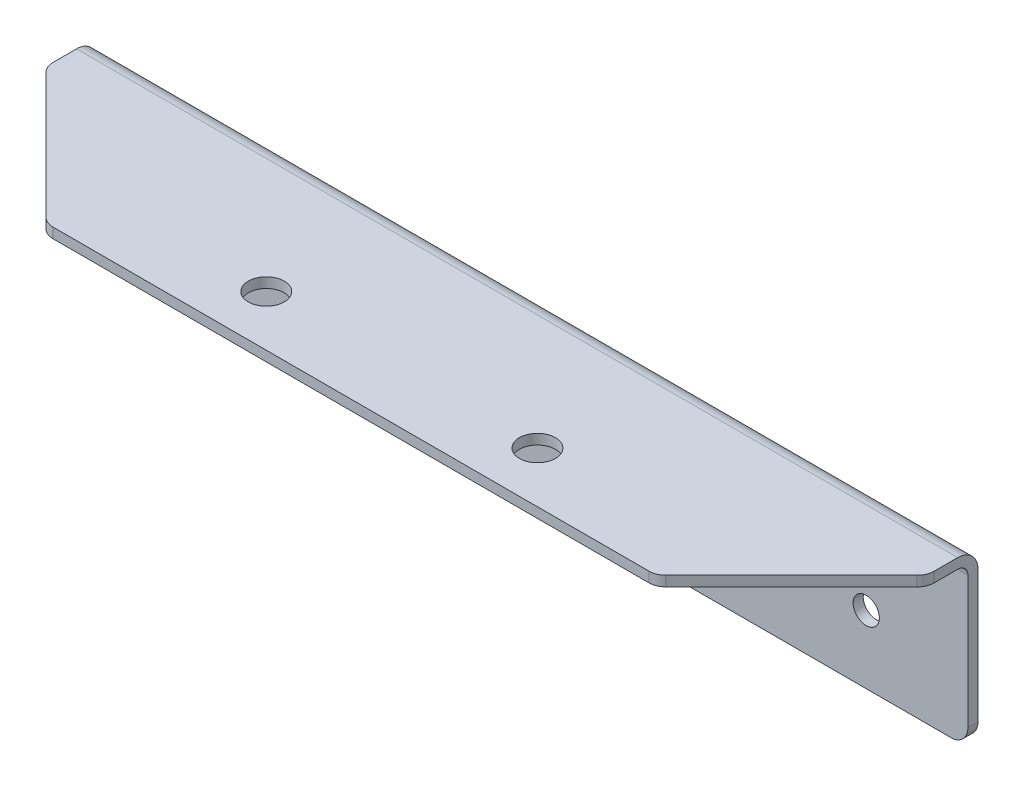
ISO-10303-21;
HEADER;
FILE_DESCRIPTION(('STEP AP214'),'2;1');
FILE_NAME('part.step','',(''),(''),'','','');
FILE_SCHEMA(('AUTOMOTIVE_DESIGN { 1 0 10303 214 1 1 1 1 }'));
ENDSEC;
DATA;
#1=APPLICATION_CONTEXT('core data for automotive mechanical design processes');
#2=APPLICATION_PROTOCOL_DEFINITION('international standard','automotive_design',2000,#1);
#3=PRODUCT_CONTEXT('',#1,'mechanical');
#4=PRODUCT('Part','Part','',(#3));
#5=PRODUCT_RELATED_PRODUCT_CATEGORY('part','',(#4));
#6=PRODUCT_DEFINITION_FORMATION('','',#4);
#7=PRODUCT_DEFINITION_CONTEXT('part definition',#1,'design');
#8=PRODUCT_DEFINITION('design','',#6,#7);
#9=PRODUCT_DEFINITION_SHAPE('','',#8);
#10=(LENGTH_UNIT() NAMED_UNIT(*) SI_UNIT(.MILLI.,.METRE.));
#11=(NAMED_UNIT(*) PLANE_ANGLE_UNIT() SI_UNIT($,.RADIAN.));
#12=(NAMED_UNIT(*) SI_UNIT($,.STERADIAN.) SOLID_ANGLE_UNIT());
#13=UNCERTAINTY_MEASURE_WITH_UNIT(LENGTH_MEASURE(1.E-05),#10,'distance_accuracy_value','');
#14=(GEOMETRIC_REPRESENTATION_CONTEXT(3) GLOBAL_UNCERTAINTY_ASSIGNED_CONTEXT((#13)) GLOBAL_UNIT_ASSIGNED_CONTEXT((#10,
#11,#12)) REPRESENTATION_CONTEXT('',''));
#15=CARTESIAN_POINT('',(0.,0.,0.));
#16=DIRECTION('',(0.,0.,1.));
#17=DIRECTION('',(1.,0.,0.));
#18=AXIS2_PLACEMENT_3D('',#15,#16,#17);
#19=CARTESIAN_POINT('',(-7208.55175,-740.648760000001,8.86714));
#20=DIRECTION('',(-1.,0.,0.));
#21=DIRECTION('',(0.,0.707106781186548,-0.707106781186548));
#22=AXIS2_PLACEMENT_3D('',#19,#20,#21);
#23=CYLINDRICAL_SURFACE('',#22,1.89738);
#24=CARTESIAN_POINT('',(-7126.00175,-740.648760000001,8.86714));
#25=DIRECTION('',(-1.,0.,0.));
#26=DIRECTION('',(0.,-1.,0.));
#27=AXIS2_PLACEMENT_3D('',#24,#25,#26);
#28=CIRCLE('',#27,1.89738);
#29=CARTESIAN_POINT('',(-7126.00175,-738.751380000001,8.86714));
#30=VERTEX_POINT('',#29);
#31=CARTESIAN_POINT('',(-7126.00175,-740.648760000001,6.96976));
#32=VERTEX_POINT('',#31);
#33=EDGE_CURVE('E20',#30,#32,#28,.T.);
#34=ORIENTED_EDGE('',*,*,#33,.F.);
#35=DIRECTION('',(-1.,0.,0.));
#36=VECTOR('',#35,1.);
#37=CARTESIAN_POINT('',(-7208.55175,-738.751380000001,8.86714));
#38=LINE('',#37,#36);
#39=CARTESIAN_POINT('',(-7291.10175,-738.751380000001,8.86713999999984));
#40=VERTEX_POINT('',#39);
#41=EDGE_CURVE('E297',#30,#40,#38,.T.);
#42=ORIENTED_EDGE('',*,*,#41,.T.);
#43=CARTESIAN_POINT('',(-7291.10175,-740.648760000001,8.86714));
#44=DIRECTION('',(-1.,0.,0.));
#45=DIRECTION('',(0.,-1.,0.));
#46=AXIS2_PLACEMENT_3D('',#43,#44,#45);
#47=CIRCLE('',#46,1.89738);
#48=CARTESIAN_POINT('',(-7291.10175,-740.648760000001,6.96976));
#49=VERTEX_POINT('',#48);
#50=EDGE_CURVE('E380',#40,#49,#47,.T.);
#51=ORIENTED_EDGE('',*,*,#50,.T.);
#52=DIRECTION('',(-1.,0.,0.));
#53=VECTOR('',#52,1.);
#54=CARTESIAN_POINT('',(-7698.77937,-740.648760000001,6.96976));
#55=LINE('',#54,#53);
#56=EDGE_CURVE('E373',#32,#49,#55,.T.);
#57=ORIENTED_EDGE('',*,*,#56,.F.);
#58=EDGE_LOOP('',(#34,#42,#51,#57));
#59=FACE_BOUND('',#58,.T.);
#60=ADVANCED_FACE('F17',(#59),#23,.F.);
#61=CARTESIAN_POINT('',(-7208.55175,-740.648760000001,8.86714));
#62=DIRECTION('',(-1.,0.,0.));
#63=DIRECTION('',(0.,0.707106781186548,-0.707106781186548));
#64=AXIS2_PLACEMENT_3D('',#61,#62,#63);
#65=CYLINDRICAL_SURFACE('',#64,3.79476);
#66=CARTESIAN_POINT('',(-7126.00175,-740.648760000001,8.86714));
#67=DIRECTION('',(-1.,0.,0.));
#68=DIRECTION('',(0.,-1.,0.));
#69=AXIS2_PLACEMENT_3D('',#66,#67,#68);
#70=CIRCLE('',#69,3.79476);
#71=CARTESIAN_POINT('',(-7126.00175,-736.854,8.86714));
#72=VERTEX_POINT('',#71);
#73=CARTESIAN_POINT('',(-7126.00175,-740.648760000001,5.07238));
#74=VERTEX_POINT('',#73);
#75=EDGE_CURVE('E11',#72,#74,#70,.T.);
#76=ORIENTED_EDGE('',*,*,#75,.T.);
#77=DIRECTION('',(-1.,0.,0.));
#78=VECTOR('',#77,1.);
#79=CARTESIAN_POINT('',(-7208.55175,-740.648760000001,5.07238));
#80=LINE('',#79,#78);
#81=CARTESIAN_POINT('',(-7291.10175,-740.648760000001,5.07238000000007));
#82=VERTEX_POINT('',#81);
#83=EDGE_CURVE('E362',#74,#82,#80,.T.);
#84=ORIENTED_EDGE('',*,*,#83,.T.);
#85=CARTESIAN_POINT('',(-7291.10175,-740.648760000001,8.86714));
#86=DIRECTION('',(-1.,0.,0.));
#87=DIRECTION('',(0.,-1.,0.));
#88=AXIS2_PLACEMENT_3D('',#85,#86,#87);
#89=CIRCLE('',#88,3.79476);
#90=CARTESIAN_POINT('',(-7291.10175,-736.854,8.86713999999984));
#91=VERTEX_POINT('',#90);
#92=EDGE_CURVE('E377',#91,#82,#89,.T.);
#93=ORIENTED_EDGE('',*,*,#92,.F.);
#94=DIRECTION('',(-1.,0.,0.));
#95=VECTOR('',#94,1.);
#96=CARTESIAN_POINT('',(-7208.55175,-736.854,8.86714));
#97=LINE('',#96,#95);
#98=EDGE_CURVE('E277',#72,#91,#97,.T.);
#99=ORIENTED_EDGE('',*,*,#98,.F.);
#100=EDGE_LOOP('',(#76,#84,#93,#99));
#101=FACE_BOUND('',#100,.T.);
#102=ADVANCED_FACE('F454',(#101),#65,.T.);
#103=CARTESIAN_POINT('',(-7272.05175,-755.904,6.96976));
#104=DIRECTION('',(0.,0.,-1.));
#105=DIRECTION('',(-1.,0.,0.));
#106=AXIS2_PLACEMENT_3D('',#103,#104,#105);
#107=CYLINDRICAL_SURFACE('',#106,2.45744999999964);
#108=CARTESIAN_POINT('',(-7272.05175,-755.904,5.07238));
#109=DIRECTION('',(0.,0.,-1.));
#110=DIRECTION('',(1.,0.,0.));
#111=AXIS2_PLACEMENT_3D('',#108,#109,#110);
#112=CIRCLE('',#111,2.45744999999964);
#113=CARTESIAN_POINT('',(-7269.5943,-755.904,5.07238));
#114=VERTEX_POINT('',#113);
#115=EDGE_CURVE('E350',#114,#114,#112,.T.);
#116=ORIENTED_EDGE('',*,*,#115,.T.);
#117=EDGE_LOOP('',(#116));
#118=FACE_BOUND('',#117,.T.);
#119=CARTESIAN_POINT('',(-7272.05175,-755.904,6.96976));
#120=DIRECTION('',(0.,0.,-1.));
#121=DIRECTION('',(-1.,0.,0.));
#122=AXIS2_PLACEMENT_3D('',#119,#120,#121);
#123=CIRCLE('',#122,2.45744999999964);
#124=CARTESIAN_POINT('',(-7274.5092,-755.904,6.96976));
#125=VERTEX_POINT('',#124);
#126=EDGE_CURVE('E250',#125,#125,#123,.T.);
#127=ORIENTED_EDGE('',*,*,#126,.F.);
#128=EDGE_LOOP('',(#127));
#129=FACE_BOUND('',#128,.T.);
#130=ADVANCED_FACE('F456',(#118,#129),#107,.F.);
#131=CARTESIAN_POINT('',(-7176.80175,-755.904,6.96976));
#132=DIRECTION('',(0.,0.,-1.));
#133=DIRECTION('',(-1.,0.,0.));
#134=AXIS2_PLACEMENT_3D('',#131,#132,#133);
#135=CYLINDRICAL_SURFACE('',#134,2.45744999999964);
#136=CARTESIAN_POINT('',(-7176.80175,-755.904,5.07238));
#137=DIRECTION('',(0.,0.,-1.));
#138=DIRECTION('',(1.,0.,0.));
#139=AXIS2_PLACEMENT_3D('',#136,#137,#138);
#140=CIRCLE('',#139,2.45744999999964);
#141=CARTESIAN_POINT('',(-7174.3443,-755.904,5.07238));
#142=VERTEX_POINT('',#141);
#143=EDGE_CURVE('E306',#142,#142,#140,.T.);
#144=ORIENTED_EDGE('',*,*,#143,.T.);
#145=EDGE_LOOP('',(#144));
#146=FACE_BOUND('',#145,.T.);
#147=CARTESIAN_POINT('',(-7176.80175,-755.904,6.96976));
#148=DIRECTION('',(0.,0.,-1.));
#149=DIRECTION('',(-1.,0.,0.));
#150=AXIS2_PLACEMENT_3D('',#147,#148,#149);
#151=CIRCLE('',#150,2.45744999999964);
#152=CARTESIAN_POINT('',(-7179.2592,-755.904,6.96976));
#153=VERTEX_POINT('',#152);
#154=EDGE_CURVE('E245',#153,#153,#151,.T.);
#155=ORIENTED_EDGE('',*,*,#154,.F.);
#156=EDGE_LOOP('',(#155));
#157=FACE_BOUND('',#156,.T.);
#158=ADVANCED_FACE('F448',(#146,#157),#135,.F.);
#159=CARTESIAN_POINT('',(-7240.30175,-755.904,6.96976));
#160=DIRECTION('',(0.,0.,-1.));
#161=DIRECTION('',(-1.,0.,0.));
#162=AXIS2_PLACEMENT_3D('',#159,#160,#161);
#163=CYLINDRICAL_SURFACE('',#162,2.45744999999964);
#164=CARTESIAN_POINT('',(-7240.30175,-755.904,5.07238));
#165=DIRECTION('',(0.,0.,-1.));
#166=DIRECTION('',(1.,0.,0.));
#167=AXIS2_PLACEMENT_3D('',#164,#165,#166);
#168=CIRCLE('',#167,2.45744999999964);
#169=CARTESIAN_POINT('',(-7237.8443,-755.904,5.07238));
#170=VERTEX_POINT('',#169);
#171=EDGE_CURVE('E304',#170,#170,#168,.T.);
#172=ORIENTED_EDGE('',*,*,#171,.T.);
#173=EDGE_LOOP('',(#172));
#174=FACE_BOUND('',#173,.T.);
#175=CARTESIAN_POINT('',(-7240.30175,-755.904,6.96976));
#176=DIRECTION('',(0.,0.,-1.));
#177=DIRECTION('',(-1.,0.,0.));
#178=AXIS2_PLACEMENT_3D('',#175,#176,#177);
#179=CIRCLE('',#178,2.45744999999964);
#180=CARTESIAN_POINT('',(-7242.7592,-755.904,6.96976));
#181=VERTEX_POINT('',#180);
#182=EDGE_CURVE('E247',#181,#181,#179,.T.);
#183=ORIENTED_EDGE('',*,*,#182,.F.);
#184=EDGE_LOOP('',(#183));
#185=FACE_BOUND('',#184,.T.);
#186=ADVANCED_FACE('F438',(#174,#185),#163,.F.);
#187=CARTESIAN_POINT('',(-7145.05175,-755.904,6.96976));
#188=DIRECTION('',(0.,0.,-1.));
#189=DIRECTION('',(-1.,0.,0.));
#190=AXIS2_PLACEMENT_3D('',#187,#188,#189);
#191=CYLINDRICAL_SURFACE('',#190,2.45744999999964);
#192=CARTESIAN_POINT('',(-7145.05175,-755.904,5.07238));
#193=DIRECTION('',(0.,0.,-1.));
#194=DIRECTION('',(1.,0.,0.));
#195=AXIS2_PLACEMENT_3D('',#192,#193,#194);
#196=CIRCLE('',#195,2.45744999999964);
#197=CARTESIAN_POINT('',(-7142.5943,-755.904,5.07238));
#198=VERTEX_POINT('',#197);
#199=EDGE_CURVE('E307',#198,#198,#196,.T.);
#200=ORIENTED_EDGE('',*,*,#199,.T.);
#201=EDGE_LOOP('',(#200));
#202=FACE_BOUND('',#201,.T.);
#203=CARTESIAN_POINT('',(-7145.05175,-755.904,6.96976));
#204=DIRECTION('',(0.,0.,-1.));
#205=DIRECTION('',(-1.,0.,0.));
#206=AXIS2_PLACEMENT_3D('',#203,#204,#205);
#207=CIRCLE('',#206,2.45744999999964);
#208=CARTESIAN_POINT('',(-7147.5092,-755.904,6.96976));
#209=VERTEX_POINT('',#208);
#210=EDGE_CURVE('E292',#209,#209,#207,.T.);
#211=ORIENTED_EDGE('',*,*,#210,.F.);
#212=EDGE_LOOP('',(#211));
#213=FACE_BOUND('',#212,.T.);
#214=ADVANCED_FACE('F436',(#202,#213),#191,.F.);
#215=CARTESIAN_POINT('',(-7208.55175,-755.904,6.96976));
#216=DIRECTION('',(0.,0.,-1.));
#217=DIRECTION('',(-1.,0.,0.));
#218=AXIS2_PLACEMENT_3D('',#215,#216,#217);
#219=CYLINDRICAL_SURFACE('',#218,2.45744999999964);
#220=CARTESIAN_POINT('',(-7208.55175,-755.904,5.07238));
#221=DIRECTION('',(0.,0.,-1.));
#222=DIRECTION('',(1.,0.,0.));
#223=AXIS2_PLACEMENT_3D('',#220,#221,#222);
#224=CIRCLE('',#223,2.45744999999964);
#225=CARTESIAN_POINT('',(-7206.0943,-755.904,5.07238));
#226=VERTEX_POINT('',#225);
#227=EDGE_CURVE('E359',#226,#226,#224,.T.);
#228=ORIENTED_EDGE('',*,*,#227,.T.);
#229=EDGE_LOOP('',(#228));
#230=FACE_BOUND('',#229,.T.);
#231=CARTESIAN_POINT('',(-7208.55175,-755.904,6.96976));
#232=DIRECTION('',(0.,0.,-1.));
#233=DIRECTION('',(-1.,0.,0.));
#234=AXIS2_PLACEMENT_3D('',#231,#232,#233);
#235=CIRCLE('',#234,2.45744999999964);
#236=CARTESIAN_POINT('',(-7211.0092,-755.904,6.96976));
#237=VERTEX_POINT('',#236);
#238=EDGE_CURVE('E369',#237,#237,#235,.T.);
#239=ORIENTED_EDGE('',*,*,#238,.F.);
#240=EDGE_LOOP('',(#239));
#241=FACE_BOUND('',#240,.T.);
#242=ADVANCED_FACE('F437',(#230,#241),#219,.F.);
#243=CARTESIAN_POINT('',(-7698.77937,-288.925,6.96976));
#244=DIRECTION('',(0.,0.,1.));
#245=DIRECTION('',(1.,0.,0.));
#246=AXIS2_PLACEMENT_3D('',#243,#244,#245);
#247=PLANE('',#246);
#248=DIRECTION('',(-1.,0.,0.));
#249=VECTOR('',#248,1.);
#250=CARTESIAN_POINT('',(-7698.77937,-768.604,6.96976));
#251=LINE('',#250,#249);
#252=CARTESIAN_POINT('',(-7129.17675,-768.604,6.96976));
#253=VERTEX_POINT('',#252);
#254=CARTESIAN_POINT('',(-7287.92675,-768.604,6.96976));
#255=VERTEX_POINT('',#254);
#256=EDGE_CURVE('E281',#253,#255,#251,.T.);
#257=ORIENTED_EDGE('',*,*,#256,.F.);
#258=CARTESIAN_POINT('',(-7129.17675,-765.429,6.96976));
#259=DIRECTION('',(0.,0.,-1.));
#260=DIRECTION('',(1.,0.,0.));
#261=AXIS2_PLACEMENT_3D('',#258,#259,#260);
#262=CIRCLE('',#261,3.175);
#263=CARTESIAN_POINT('',(-7126.00175,-765.429,6.96976));
#264=VERTEX_POINT('',#263);
#265=EDGE_CURVE('E330',#264,#253,#262,.T.);
#266=ORIENTED_EDGE('',*,*,#265,.F.);
#267=DIRECTION('',(0.,1.,0.));
#268=VECTOR('',#267,1.);
#269=CARTESIAN_POINT('',(-7126.00175,-288.925,6.96976));
#270=LINE('',#269,#268);
#271=EDGE_CURVE('E318',#264,#32,#270,.T.);
#272=ORIENTED_EDGE('',*,*,#271,.T.);
#273=ORIENTED_EDGE('',*,*,#56,.T.);
#274=DIRECTION('',(0.,-1.,0.));
#275=VECTOR('',#274,1.);
#276=CARTESIAN_POINT('',(-7291.10175,-288.925,6.96976));
#277=LINE('',#276,#275);
#278=CARTESIAN_POINT('',(-7291.10175,-765.429,6.96976));
#279=VERTEX_POINT('',#278);
#280=EDGE_CURVE('E313',#49,#279,#277,.T.);
#281=ORIENTED_EDGE('',*,*,#280,.T.);
#282=CARTESIAN_POINT('',(-7287.92675,-765.429,6.96976));
#283=DIRECTION('',(0.,0.,-1.));
#284=DIRECTION('',(1.,0.,0.));
#285=AXIS2_PLACEMENT_3D('',#282,#283,#284);
#286=CIRCLE('',#285,3.175);
#287=EDGE_CURVE('E48',#255,#279,#286,.T.);
#288=ORIENTED_EDGE('',*,*,#287,.F.);
#289=EDGE_LOOP('',(#257,#266,#272,#273,#281,#288));
#290=FACE_BOUND('',#289,.T.);
#291=ORIENTED_EDGE('',*,*,#238,.T.);
#292=EDGE_LOOP('',(#291));
#293=FACE_BOUND('',#292,.T.);
#294=ORIENTED_EDGE('',*,*,#210,.T.);
#295=EDGE_LOOP('',(#294));
#296=FACE_BOUND('',#295,.T.);
#297=ORIENTED_EDGE('',*,*,#182,.T.);
#298=EDGE_LOOP('',(#297));
#299=FACE_BOUND('',#298,.T.);
#300=ORIENTED_EDGE('',*,*,#154,.T.);
#301=EDGE_LOOP('',(#300));
#302=FACE_BOUND('',#301,.T.);
#303=ORIENTED_EDGE('',*,*,#126,.T.);
#304=EDGE_LOOP('',(#303));
#305=FACE_BOUND('',#304,.T.);
#306=ADVANCED_FACE('F394',(#290,#293,#296,#299,#302,#305),#247,.T.);
#307=CARTESIAN_POINT('',(-7698.77937,-288.925,5.07238));
#308=DIRECTION('',(0.,0.,1.));
#309=DIRECTION('',(1.,0.,0.));
#310=AXIS2_PLACEMENT_3D('',#307,#308,#309);
#311=PLANE('',#310);
#312=DIRECTION('',(-1.,0.,0.));
#313=VECTOR('',#312,1.);
#314=CARTESIAN_POINT('',(-7208.55175,-768.604,5.07238));
#315=LINE('',#314,#313);
#316=CARTESIAN_POINT('',(-7129.17675,-768.604,5.07238));
#317=VERTEX_POINT('',#316);
#318=CARTESIAN_POINT('',(-7287.92675,-768.604,5.07238));
#319=VERTEX_POINT('',#318);
#320=EDGE_CURVE('E339',#317,#319,#315,.T.);
#321=ORIENTED_EDGE('',*,*,#320,.T.);
#322=CARTESIAN_POINT('',(-7287.92675,-765.429,5.07238));
#323=DIRECTION('',(0.,0.,-1.));
#324=DIRECTION('',(-1.,0.,0.));
#325=AXIS2_PLACEMENT_3D('',#322,#323,#324);
#326=CIRCLE('',#325,3.175);
#327=CARTESIAN_POINT('',(-7291.10175,-765.429,5.07238));
#328=VERTEX_POINT('',#327);
#329=EDGE_CURVE('E36',#319,#328,#326,.T.);
#330=ORIENTED_EDGE('',*,*,#329,.T.);
#331=DIRECTION('',(0.,-1.,0.));
#332=VECTOR('',#331,1.);
#333=CARTESIAN_POINT('',(-7291.10175,-752.729,5.07238));
#334=LINE('',#333,#332);
#335=EDGE_CURVE('E314',#82,#328,#334,.T.);
#336=ORIENTED_EDGE('',*,*,#335,.F.);
#337=ORIENTED_EDGE('',*,*,#83,.F.);
#338=DIRECTION('',(0.,1.,0.));
#339=VECTOR('',#338,1.);
#340=CARTESIAN_POINT('',(-7126.00175,-288.925,5.07238));
#341=LINE('',#340,#339);
#342=CARTESIAN_POINT('',(-7126.00175,-765.429,5.07238));
#343=VERTEX_POINT('',#342);
#344=EDGE_CURVE('E326',#343,#74,#341,.T.);
#345=ORIENTED_EDGE('',*,*,#344,.F.);
#346=CARTESIAN_POINT('',(-7129.17675,-765.429,5.07238));
#347=DIRECTION('',(0.,0.,-1.));
#348=DIRECTION('',(-1.,0.,0.));
#349=AXIS2_PLACEMENT_3D('',#346,#347,#348);
#350=CIRCLE('',#349,3.175);
#351=EDGE_CURVE('E280',#343,#317,#350,.T.);
#352=ORIENTED_EDGE('',*,*,#351,.T.);
#353=EDGE_LOOP('',(#321,#330,#336,#337,#345,#352));
#354=FACE_BOUND('',#353,.T.);
#355=ORIENTED_EDGE('',*,*,#227,.F.);
#356=EDGE_LOOP('',(#355));
#357=FACE_BOUND('',#356,.T.);
#358=ORIENTED_EDGE('',*,*,#199,.F.);
#359=EDGE_LOOP('',(#358));
#360=FACE_BOUND('',#359,.T.);
#361=ORIENTED_EDGE('',*,*,#171,.F.);
#362=EDGE_LOOP('',(#361));
#363=FACE_BOUND('',#362,.T.);
#364=ORIENTED_EDGE('',*,*,#143,.F.);
#365=EDGE_LOOP('',(#364));
#366=FACE_BOUND('',#365,.T.);
#367=ORIENTED_EDGE('',*,*,#115,.F.);
#368=EDGE_LOOP('',(#367));
#369=FACE_BOUND('',#368,.T.);
#370=ADVANCED_FACE('F464',(#354,#357,#360,#363,#366,#369),#311,.F.);
#371=CARTESIAN_POINT('',(-7287.92675,-765.429,5.07238));
#372=DIRECTION('',(0.,0.,1.));
#373=DIRECTION('',(1.,0.,0.));
#374=AXIS2_PLACEMENT_3D('',#371,#372,#373);
#375=CYLINDRICAL_SURFACE('',#374,3.175);
#376=ORIENTED_EDGE('',*,*,#287,.T.);
#377=DIRECTION('',(0.,0.,-1.));
#378=VECTOR('',#377,1.);
#379=CARTESIAN_POINT('',(-7291.10175,-765.429,5.07238));
#380=LINE('',#379,#378);
#381=EDGE_CURVE('E305',#279,#328,#380,.T.);
#382=ORIENTED_EDGE('',*,*,#381,.T.);
#383=ORIENTED_EDGE('',*,*,#329,.F.);
#384=DIRECTION('',(0.,0.,-1.));
#385=VECTOR('',#384,1.);
#386=CARTESIAN_POINT('',(-7287.92675,-768.604,5.07238));
#387=LINE('',#386,#385);
#388=EDGE_CURVE('E331',#255,#319,#387,.T.);
#389=ORIENTED_EDGE('',*,*,#388,.F.);
#390=EDGE_LOOP('',(#376,#382,#383,#389));
#391=FACE_BOUND('',#390,.T.);
#392=ADVANCED_FACE('F466',(#391),#375,.T.);
#393=CARTESIAN_POINT('',(-7208.55175,-768.604,5.07238));
#394=DIRECTION('',(0.,1.,0.));
#395=DIRECTION('',(1.,0.,0.));
#396=AXIS2_PLACEMENT_3D('',#393,#394,#395);
#397=PLANE('',#396);
#398=DIRECTION('',(0.,0.,-1.));
#399=VECTOR('',#398,1.);
#400=CARTESIAN_POINT('',(-7129.17675,-768.604,5.07238));
#401=LINE('',#400,#399);
#402=EDGE_CURVE('E282',#253,#317,#401,.T.);
#403=ORIENTED_EDGE('',*,*,#402,.F.);
#404=ORIENTED_EDGE('',*,*,#256,.T.);
#405=ORIENTED_EDGE('',*,*,#388,.T.);
#406=ORIENTED_EDGE('',*,*,#320,.F.);
#407=EDGE_LOOP('',(#403,#404,#405,#406));
#408=FACE_BOUND('',#407,.T.);
#409=ADVANCED_FACE('F781',(#408),#397,.F.);
#410=CARTESIAN_POINT('',(-7129.17675,-765.429,5.07238));
#411=DIRECTION('',(0.,0.,1.));
#412=DIRECTION('',(1.,0.,0.));
#413=AXIS2_PLACEMENT_3D('',#410,#411,#412);
#414=CYLINDRICAL_SURFACE('',#413,3.175);
#415=DIRECTION('',(0.,0.,-1.));
#416=VECTOR('',#415,1.);
#417=CARTESIAN_POINT('',(-7126.00175,-765.429,5.07238));
#418=LINE('',#417,#416);
#419=EDGE_CURVE('E325',#264,#343,#418,.T.);
#420=ORIENTED_EDGE('',*,*,#419,.F.);
#421=ORIENTED_EDGE('',*,*,#265,.T.);
#422=ORIENTED_EDGE('',*,*,#402,.T.);
#423=ORIENTED_EDGE('',*,*,#351,.F.);
#424=EDGE_LOOP('',(#420,#421,#422,#423));
#425=FACE_BOUND('',#424,.T.);
#426=ADVANCED_FACE('F399',(#425),#414,.T.);
#427=CARTESIAN_POINT('',(-7233.95175,-738.751380000001,30.47238));
#428=DIRECTION('',(0.,1.,0.));
#429=DIRECTION('',(0.,0.,1.));
#430=AXIS2_PLACEMENT_3D('',#427,#428,#429);
#431=CYLINDRICAL_SURFACE('',#430,3.37820000000022);
#432=CARTESIAN_POINT('',(-7233.95175,-736.854,30.47238));
#433=DIRECTION('',(0.,1.,0.));
#434=DIRECTION('',(0.,0.,-1.));
#435=AXIS2_PLACEMENT_3D('',#432,#433,#434);
#436=CIRCLE('',#435,3.37820000000022);
#437=CARTESIAN_POINT('',(-7233.95175,-736.854,27.0941799999998));
#438=VERTEX_POINT('',#437);
#439=EDGE_CURVE('E268',#438,#438,#436,.T.);
#440=ORIENTED_EDGE('',*,*,#439,.T.);
#441=EDGE_LOOP('',(#440));
#442=FACE_BOUND('',#441,.T.);
#443=CARTESIAN_POINT('',(-7233.95175,-738.751380000001,30.47238));
#444=DIRECTION('',(0.,1.,0.));
#445=DIRECTION('',(0.,0.,1.));
#446=AXIS2_PLACEMENT_3D('',#443,#444,#445);
#447=CIRCLE('',#446,3.37820000000022);
#448=CARTESIAN_POINT('',(-7233.95175,-738.751380000001,33.8505800000002));
#449=VERTEX_POINT('',#448);
#450=EDGE_CURVE('E287',#449,#449,#447,.T.);
#451=ORIENTED_EDGE('',*,*,#450,.F.);
#452=EDGE_LOOP('',(#451));
#453=FACE_BOUND('',#452,.T.);
#454=ADVANCED_FACE('F706',(#442,#453),#431,.F.);
#455=CARTESIAN_POINT('',(-7183.15175,-738.751380000001,30.47238));
#456=DIRECTION('',(0.,1.,0.));
#457=DIRECTION('',(0.,0.,1.));
#458=AXIS2_PLACEMENT_3D('',#455,#456,#457);
#459=CYLINDRICAL_SURFACE('',#458,3.37820000000022);
#460=CARTESIAN_POINT('',(-7183.15175,-736.854,30.47238));
#461=DIRECTION('',(0.,1.,0.));
#462=DIRECTION('',(0.,0.,-1.));
#463=AXIS2_PLACEMENT_3D('',#460,#461,#462);
#464=CIRCLE('',#463,3.37820000000022);
#465=CARTESIAN_POINT('',(-7183.15175,-736.854,27.0941799999998));
#466=VERTEX_POINT('',#465);
#467=EDGE_CURVE('E275',#466,#466,#464,.T.);
#468=ORIENTED_EDGE('',*,*,#467,.T.);
#469=EDGE_LOOP('',(#468));
#470=FACE_BOUND('',#469,.T.);
#471=CARTESIAN_POINT('',(-7183.15175,-738.751380000001,30.47238));
#472=DIRECTION('',(0.,1.,0.));
#473=DIRECTION('',(0.,0.,1.));
#474=AXIS2_PLACEMENT_3D('',#471,#472,#473);
#475=CIRCLE('',#474,3.37820000000022);
#476=CARTESIAN_POINT('',(-7183.15175,-738.751380000001,33.8505800000002));
#477=VERTEX_POINT('',#476);
#478=EDGE_CURVE('E288',#477,#477,#475,.T.);
#479=ORIENTED_EDGE('',*,*,#478,.F.);
#480=EDGE_LOOP('',(#479));
#481=FACE_BOUND('',#480,.T.);
#482=ADVANCED_FACE('F701',(#470,#481),#459,.F.);
#483=CARTESIAN_POINT('',(-7208.55175,-738.751380000001,39.99738));
#484=DIRECTION('',(0.,-1.,0.));
#485=DIRECTION('',(0.,0.,-1.));
#486=AXIS2_PLACEMENT_3D('',#483,#484,#485);
#487=PLANE('',#486);
#488=DIRECTION('',(0.707106781186552,0.,0.707106781186543));
#489=VECTOR('',#488,1.);
#490=CARTESIAN_POINT('',(-7291.10175,-738.751380000001,14.59738));
#491=LINE('',#490,#489);
#492=CARTESIAN_POINT('',(-7290.17181403026,-738.751380000001,15.5273159697322));
#493=VERTEX_POINT('',#492);
#494=CARTESIAN_POINT('',(-7266.63168596973,-738.751380000001,39.0674440302671));
#495=VERTEX_POINT('',#494);
#496=EDGE_CURVE('E256',#493,#495,#491,.T.);
#497=ORIENTED_EDGE('',*,*,#496,.F.);
#498=CARTESIAN_POINT('',(-7287.92675,-738.751380000001,13.2822519394648));
#499=DIRECTION('',(0.,1.,0.));
#500=DIRECTION('',(0.,0.,-1.));
#501=AXIS2_PLACEMENT_3D('',#498,#499,#500);
#502=CIRCLE('',#501,3.175);
#503=CARTESIAN_POINT('',(-7291.10175,-738.751380000001,13.2822519394648));
#504=VERTEX_POINT('',#503);
#505=EDGE_CURVE('E214',#504,#493,#502,.T.);
#506=ORIENTED_EDGE('',*,*,#505,.F.);
#507=DIRECTION('',(0.,0.,-1.));
#508=VECTOR('',#507,1.);
#509=CARTESIAN_POINT('',(-7291.10175,-738.751380000001,39.99738));
#510=LINE('',#509,#508);
#511=EDGE_CURVE('E213',#504,#40,#510,.T.);
#512=ORIENTED_EDGE('',*,*,#511,.T.);
#513=ORIENTED_EDGE('',*,*,#41,.F.);
#514=DIRECTION('',(0.,0.,-1.));
#515=VECTOR('',#514,1.);
#516=CARTESIAN_POINT('',(-7126.00175,-738.751380000001,39.99738));
#517=LINE('',#516,#515);
#518=CARTESIAN_POINT('',(-7126.00175,-738.751380000001,13.2822519394648));
#519=VERTEX_POINT('',#518);
#520=EDGE_CURVE('E177',#519,#30,#517,.T.);
#521=ORIENTED_EDGE('',*,*,#520,.F.);
#522=CARTESIAN_POINT('',(-7129.17675,-738.751380000001,13.2822519394648));
#523=DIRECTION('',(0.,1.,0.));
#524=DIRECTION('',(0.,0.,-1.));
#525=AXIS2_PLACEMENT_3D('',#522,#523,#524);
#526=CIRCLE('',#525,3.175);
#527=CARTESIAN_POINT('',(-7126.93168596973,-738.751380000001,15.5273159697322));
#528=VERTEX_POINT('',#527);
#529=EDGE_CURVE('E170',#528,#519,#526,.T.);
#530=ORIENTED_EDGE('',*,*,#529,.F.);
#531=DIRECTION('',(0.707106781186552,0.,-0.707106781186543));
#532=VECTOR('',#531,1.);
#533=CARTESIAN_POINT('',(-7151.40175,-738.751380000001,39.99738));
#534=LINE('',#533,#532);
#535=CARTESIAN_POINT('',(-7150.47181403027,-738.751380000001,39.0674440302671));
#536=VERTEX_POINT('',#535);
#537=EDGE_CURVE('E172',#536,#528,#534,.T.);
#538=ORIENTED_EDGE('',*,*,#537,.F.);
#539=CARTESIAN_POINT('',(-7152.71687806053,-738.751380000001,36.82238));
#540=DIRECTION('',(0.,1.,0.));
#541=DIRECTION('',(0.,0.,-1.));
#542=AXIS2_PLACEMENT_3D('',#539,#540,#541);
#543=CIRCLE('',#542,3.175);
#544=CARTESIAN_POINT('',(-7152.71687806053,-738.751380000001,39.99738));
#545=VERTEX_POINT('',#544);
#546=EDGE_CURVE('E210',#545,#536,#543,.T.);
#547=ORIENTED_EDGE('',*,*,#546,.F.);
#548=DIRECTION('',(-1.,0.,0.));
#549=VECTOR('',#548,1.);
#550=CARTESIAN_POINT('',(-7208.55175,-738.751380000001,39.99738));
#551=LINE('',#550,#549);
#552=CARTESIAN_POINT('',(-7264.38662193946,-738.751380000001,39.99738));
#553=VERTEX_POINT('',#552);
#554=EDGE_CURVE('E411',#545,#553,#551,.T.);
#555=ORIENTED_EDGE('',*,*,#554,.T.);
#556=CARTESIAN_POINT('',(-7264.38662193946,-738.751380000001,36.82238));
#557=DIRECTION('',(0.,1.,0.));
#558=DIRECTION('',(0.,0.,-1.));
#559=AXIS2_PLACEMENT_3D('',#556,#557,#558);
#560=CIRCLE('',#559,3.175);
#561=EDGE_CURVE('E228',#495,#553,#560,.T.);
#562=ORIENTED_EDGE('',*,*,#561,.F.);
#563=EDGE_LOOP('',(#497,#506,#512,#513,#521,#530,#538,#547,#555,#562));
#564=FACE_BOUND('',#563,.T.);
#565=ORIENTED_EDGE('',*,*,#478,.T.);
#566=EDGE_LOOP('',(#565));
#567=FACE_BOUND('',#566,.T.);
#568=ORIENTED_EDGE('',*,*,#450,.T.);
#569=EDGE_LOOP('',(#568));
#570=FACE_BOUND('',#569,.T.);
#571=ADVANCED_FACE('F166',(#564,#567,#570),#487,.T.);
#572=CARTESIAN_POINT('',(-7208.55175,-736.854,39.99738));
#573=DIRECTION('',(0.,-1.,0.));
#574=DIRECTION('',(0.,0.,-1.));
#575=AXIS2_PLACEMENT_3D('',#572,#573,#574);
#576=PLANE('',#575);
#577=DIRECTION('',(0.707106781186552,0.,0.707106781186543));
#578=VECTOR('',#577,1.);
#579=CARTESIAN_POINT('',(-7291.10175,-736.854,14.59738));
#580=LINE('',#579,#578);
#581=CARTESIAN_POINT('',(-7290.17181403026,-736.854,15.5273159697322));
#582=VERTEX_POINT('',#581);
#583=CARTESIAN_POINT('',(-7266.63168596973,-736.854,39.0674440302671));
#584=VERTEX_POINT('',#583);
#585=EDGE_CURVE('E223',#582,#584,#580,.T.);
#586=ORIENTED_EDGE('',*,*,#585,.T.);
#587=CARTESIAN_POINT('',(-7264.38662193946,-736.854,36.82238));
#588=DIRECTION('',(0.,1.,0.));
#589=DIRECTION('',(-1.,0.,0.));
#590=AXIS2_PLACEMENT_3D('',#587,#588,#589);
#591=CIRCLE('',#590,3.175);
#592=CARTESIAN_POINT('',(-7264.38662193946,-736.854,39.99738));
#593=VERTEX_POINT('',#592);
#594=EDGE_CURVE('E264',#584,#593,#591,.T.);
#595=ORIENTED_EDGE('',*,*,#594,.T.);
#596=DIRECTION('',(-1.,0.,0.));
#597=VECTOR('',#596,1.);
#598=CARTESIAN_POINT('',(-7208.55175,-736.854,39.99738));
#599=LINE('',#598,#597);
#600=CARTESIAN_POINT('',(-7152.71687806053,-736.854,39.99738));
#601=VERTEX_POINT('',#600);
#602=EDGE_CURVE('E414',#601,#593,#599,.T.);
#603=ORIENTED_EDGE('',*,*,#602,.F.);
#604=CARTESIAN_POINT('',(-7152.71687806053,-736.854,36.82238));
#605=DIRECTION('',(0.,1.,0.));
#606=DIRECTION('',(-1.,0.,0.));
#607=AXIS2_PLACEMENT_3D('',#604,#605,#606);
#608=CIRCLE('',#607,3.175);
#609=CARTESIAN_POINT('',(-7150.47181403027,-736.854,39.0674440302671));
#610=VERTEX_POINT('',#609);
#611=EDGE_CURVE('E196',#601,#610,#608,.T.);
#612=ORIENTED_EDGE('',*,*,#611,.T.);
#613=DIRECTION('',(0.707106781186552,0.,-0.707106781186543));
#614=VECTOR('',#613,1.);
#615=CARTESIAN_POINT('',(-7151.40175,-736.854,39.99738));
#616=LINE('',#615,#614);
#617=CARTESIAN_POINT('',(-7126.93168596973,-736.854,15.5273159697322));
#618=VERTEX_POINT('',#617);
#619=EDGE_CURVE('E181',#610,#618,#616,.T.);
#620=ORIENTED_EDGE('',*,*,#619,.T.);
#621=CARTESIAN_POINT('',(-7129.17675,-736.854,13.2822519394648));
#622=DIRECTION('',(0.,1.,0.));
#623=DIRECTION('',(-1.,0.,0.));
#624=AXIS2_PLACEMENT_3D('',#621,#622,#623);
#625=CIRCLE('',#624,3.175);
#626=CARTESIAN_POINT('',(-7126.00175,-736.854,13.2822519394648));
#627=VERTEX_POINT('',#626);
#628=EDGE_CURVE('E187',#618,#627,#625,.T.);
#629=ORIENTED_EDGE('',*,*,#628,.T.);
#630=DIRECTION('',(0.,0.,-1.));
#631=VECTOR('',#630,1.);
#632=CARTESIAN_POINT('',(-7126.00175,-736.854,39.99738));
#633=LINE('',#632,#631);
#634=EDGE_CURVE('E209',#627,#72,#633,.T.);
#635=ORIENTED_EDGE('',*,*,#634,.T.);
#636=ORIENTED_EDGE('',*,*,#98,.T.);
#637=DIRECTION('',(0.,0.,-1.));
#638=VECTOR('',#637,1.);
#639=CARTESIAN_POINT('',(-7291.10175,-736.854,39.99738));
#640=LINE('',#639,#638);
#641=CARTESIAN_POINT('',(-7291.10175,-736.854,13.2822519394648));
#642=VERTEX_POINT('',#641);
#643=EDGE_CURVE('E219',#642,#91,#640,.T.);
#644=ORIENTED_EDGE('',*,*,#643,.F.);
#645=CARTESIAN_POINT('',(-7287.92675,-736.854,13.2822519394648));
#646=DIRECTION('',(0.,1.,0.));
#647=DIRECTION('',(-1.,0.,0.));
#648=AXIS2_PLACEMENT_3D('',#645,#646,#647);
#649=CIRCLE('',#648,3.175);
#650=EDGE_CURVE('E255',#642,#582,#649,.T.);
#651=ORIENTED_EDGE('',*,*,#650,.T.);
#652=EDGE_LOOP('',(#586,#595,#603,#612,#620,#629,#635,#636,#644,#651));
#653=FACE_BOUND('',#652,.T.);
#654=ORIENTED_EDGE('',*,*,#467,.F.);
#655=EDGE_LOOP('',(#654));
#656=FACE_BOUND('',#655,.T.);
#657=ORIENTED_EDGE('',*,*,#439,.F.);
#658=EDGE_LOOP('',(#657));
#659=FACE_BOUND('',#658,.T.);
#660=ADVANCED_FACE('F480',(#653,#656,#659),#576,.F.);
#661=CARTESIAN_POINT('',(-7264.38662193946,-736.854,36.82238));
#662=DIRECTION('',(0.,-1.,0.));
#663=DIRECTION('',(0.,0.,-1.));
#664=AXIS2_PLACEMENT_3D('',#661,#662,#663);
#665=CYLINDRICAL_SURFACE('',#664,3.175);
#666=ORIENTED_EDGE('',*,*,#561,.T.);
#667=DIRECTION('',(0.,1.,0.));
#668=VECTOR('',#667,1.);
#669=CARTESIAN_POINT('',(-7264.38662193946,-736.854,39.99738));
#670=LINE('',#669,#668);
#671=EDGE_CURVE('E413',#553,#593,#670,.T.);
#672=ORIENTED_EDGE('',*,*,#671,.T.);
#673=ORIENTED_EDGE('',*,*,#594,.F.);
#674=DIRECTION('',(0.,1.,0.));
#675=VECTOR('',#674,1.);
#676=CARTESIAN_POINT('',(-7266.63168596973,-736.854,39.0674440302671));
#677=LINE('',#676,#675);
#678=EDGE_CURVE('E230',#495,#584,#677,.T.);
#679=ORIENTED_EDGE('',*,*,#678,.F.);
#680=EDGE_LOOP('',(#666,#672,#673,#679));
#681=FACE_BOUND('',#680,.T.);
#682=ADVANCED_FACE('F720',(#681),#665,.T.);
#683=CARTESIAN_POINT('',(-7291.10175,-736.854,14.59738));
#684=DIRECTION('',(-0.707106781186543,0.,0.707106781186552));
#685=DIRECTION('',(0.,1.,0.));
#686=AXIS2_PLACEMENT_3D('',#683,#684,#685);
#687=PLANE('',#686);
#688=DIRECTION('',(0.,1.,0.));
#689=VECTOR('',#688,1.);
#690=CARTESIAN_POINT('',(-7290.17181403026,-736.854,15.5273159697322));
#691=LINE('',#690,#689);
#692=EDGE_CURVE('E218',#493,#582,#691,.T.);
#693=ORIENTED_EDGE('',*,*,#692,.F.);
#694=ORIENTED_EDGE('',*,*,#496,.T.);
#695=ORIENTED_EDGE('',*,*,#678,.T.);
#696=ORIENTED_EDGE('',*,*,#585,.F.);
#697=EDGE_LOOP('',(#693,#694,#695,#696));
#698=FACE_BOUND('',#697,.T.);
#699=ADVANCED_FACE('F737',(#698),#687,.T.);
#700=CARTESIAN_POINT('',(-7287.92675,-736.854,13.2822519394648));
#701=DIRECTION('',(0.,-1.,0.));
#702=DIRECTION('',(0.,0.,-1.));
#703=AXIS2_PLACEMENT_3D('',#700,#701,#702);
#704=CYLINDRICAL_SURFACE('',#703,3.175);
#705=DIRECTION('',(0.,1.,0.));
#706=VECTOR('',#705,1.);
#707=CARTESIAN_POINT('',(-7291.10175,-736.854,13.2822519394648));
#708=LINE('',#707,#706);
#709=EDGE_CURVE('E238',#504,#642,#708,.T.);
#710=ORIENTED_EDGE('',*,*,#709,.F.);
#711=ORIENTED_EDGE('',*,*,#505,.T.);
#712=ORIENTED_EDGE('',*,*,#692,.T.);
#713=ORIENTED_EDGE('',*,*,#650,.F.);
#714=EDGE_LOOP('',(#710,#711,#712,#713));
#715=FACE_BOUND('',#714,.T.);
#716=ADVANCED_FACE('F475',(#715),#704,.T.);
#717=CARTESIAN_POINT('',(-7291.10175,-736.854,39.99738));
#718=DIRECTION('',(-1.,0.,0.));
#719=DIRECTION('',(0.,0.,1.));
#720=AXIS2_PLACEMENT_3D('',#717,#718,#719);
#721=PLANE('',#720);
#722=ORIENTED_EDGE('',*,*,#643,.T.);
#723=ORIENTED_EDGE('',*,*,#92,.T.);
#724=ORIENTED_EDGE('',*,*,#335,.T.);
#725=ORIENTED_EDGE('',*,*,#381,.F.);
#726=ORIENTED_EDGE('',*,*,#280,.F.);
#727=ORIENTED_EDGE('',*,*,#50,.F.);
#728=ORIENTED_EDGE('',*,*,#511,.F.);
#729=ORIENTED_EDGE('',*,*,#709,.T.);
#730=EDGE_LOOP('',(#722,#723,#724,#725,#726,#727,#728,#729));
#731=FACE_BOUND('',#730,.T.);
#732=ADVANCED_FACE('F469',(#731),#721,.T.);
#733=CARTESIAN_POINT('',(-7126.00175,-736.854,39.99738));
#734=DIRECTION('',(-1.,0.,0.));
#735=DIRECTION('',(0.,0.,1.));
#736=AXIS2_PLACEMENT_3D('',#733,#734,#735);
#737=PLANE('',#736);
#738=DIRECTION('',(0.,1.,0.));
#739=VECTOR('',#738,1.);
#740=CARTESIAN_POINT('',(-7126.00175,-736.854,13.2822519394648));
#741=LINE('',#740,#739);
#742=EDGE_CURVE('E185',#519,#627,#741,.T.);
#743=ORIENTED_EDGE('',*,*,#742,.F.);
#744=ORIENTED_EDGE('',*,*,#520,.T.);
#745=ORIENTED_EDGE('',*,*,#33,.T.);
#746=ORIENTED_EDGE('',*,*,#271,.F.);
#747=ORIENTED_EDGE('',*,*,#419,.T.);
#748=ORIENTED_EDGE('',*,*,#344,.T.);
#749=ORIENTED_EDGE('',*,*,#75,.F.);
#750=ORIENTED_EDGE('',*,*,#634,.F.);
#751=EDGE_LOOP('',(#743,#744,#745,#746,#747,#748,#749,#750));
#752=FACE_BOUND('',#751,.T.);
#753=ADVANCED_FACE('F388',(#752),#737,.F.);
#754=CARTESIAN_POINT('',(-7129.17675,-736.854,13.2822519394648));
#755=DIRECTION('',(0.,-1.,0.));
#756=DIRECTION('',(0.,0.,-1.));
#757=AXIS2_PLACEMENT_3D('',#754,#755,#756);
#758=CYLINDRICAL_SURFACE('',#757,3.175);
#759=DIRECTION('',(0.,1.,0.));
#760=VECTOR('',#759,1.);
#761=CARTESIAN_POINT('',(-7126.93168596973,-736.854,15.5273159697322));
#762=LINE('',#761,#760);
#763=EDGE_CURVE('E184',#528,#618,#762,.T.);
#764=ORIENTED_EDGE('',*,*,#763,.F.);
#765=ORIENTED_EDGE('',*,*,#529,.T.);
#766=ORIENTED_EDGE('',*,*,#742,.T.);
#767=ORIENTED_EDGE('',*,*,#628,.F.);
#768=EDGE_LOOP('',(#764,#765,#766,#767));
#769=FACE_BOUND('',#768,.T.);
#770=ADVANCED_FACE('F186',(#769),#758,.T.);
#771=CARTESIAN_POINT('',(-7151.40175,-736.854,39.99738));
#772=DIRECTION('',(-0.707106781186543,0.,-0.707106781186552));
#773=DIRECTION('',(-0.707106781186552,0.,0.707106781186543));
#774=AXIS2_PLACEMENT_3D('',#771,#772,#773);
#775=PLANE('',#774);
#776=DIRECTION('',(0.,1.,0.));
#777=VECTOR('',#776,1.);
#778=CARTESIAN_POINT('',(-7150.47181403027,-736.854,39.0674440302671));
#779=LINE('',#778,#777);
#780=EDGE_CURVE('E193',#536,#610,#779,.T.);
#781=ORIENTED_EDGE('',*,*,#780,.F.);
#782=ORIENTED_EDGE('',*,*,#537,.T.);
#783=ORIENTED_EDGE('',*,*,#763,.T.);
#784=ORIENTED_EDGE('',*,*,#619,.F.);
#785=EDGE_LOOP('',(#781,#782,#783,#784));
#786=FACE_BOUND('',#785,.T.);
#787=ADVANCED_FACE('F194',(#786),#775,.F.);
#788=CARTESIAN_POINT('',(-7152.71687806053,-736.854,36.82238));
#789=DIRECTION('',(0.,-1.,0.));
#790=DIRECTION('',(0.,0.,-1.));
#791=AXIS2_PLACEMENT_3D('',#788,#789,#790);
#792=CYLINDRICAL_SURFACE('',#791,3.175);
#793=DIRECTION('',(0.,1.,0.));
#794=VECTOR('',#793,1.);
#795=CARTESIAN_POINT('',(-7152.71687806053,-736.854,39.99738));
#796=LINE('',#795,#794);
#797=EDGE_CURVE('E408',#545,#601,#796,.T.);
#798=ORIENTED_EDGE('',*,*,#797,.F.);
#799=ORIENTED_EDGE('',*,*,#546,.T.);
#800=ORIENTED_EDGE('',*,*,#780,.T.);
#801=ORIENTED_EDGE('',*,*,#611,.F.);
#802=EDGE_LOOP('',(#798,#799,#800,#801));
#803=FACE_BOUND('',#802,.T.);
#804=ADVANCED_FACE('F485',(#803),#792,.T.);
#805=CARTESIAN_POINT('',(-7208.55175,-736.854,39.99738));
#806=DIRECTION('',(0.,0.,1.));
#807=DIRECTION('',(1.,0.,0.));
#808=AXIS2_PLACEMENT_3D('',#805,#806,#807);
#809=PLANE('',#808);
#810=ORIENTED_EDGE('',*,*,#671,.F.);
#811=ORIENTED_EDGE('',*,*,#554,.F.);
#812=ORIENTED_EDGE('',*,*,#797,.T.);
#813=ORIENTED_EDGE('',*,*,#602,.T.);
#814=EDGE_LOOP('',(#810,#811,#812,#813));
#815=FACE_BOUND('',#814,.T.);
#816=ADVANCED_FACE('F659',(#815),#809,.T.);
#817=CLOSED_SHELL('',(#60,#102,#130,#158,#186,#214,#242,#306,#370,#392,#409,#426,#454,#482,#571,
#660,#682,#699,#716,#732,#753,#770,#787,#804,#816));
#818=MANIFOLD_SOLID_BREP('B1',#817);
#819=ADVANCED_BREP_SHAPE_REPRESENTATION('',(#18,#818),#14);
#820=SHAPE_DEFINITION_REPRESENTATION(#9,#819);
ENDSEC;
END-ISO-10303-21;
